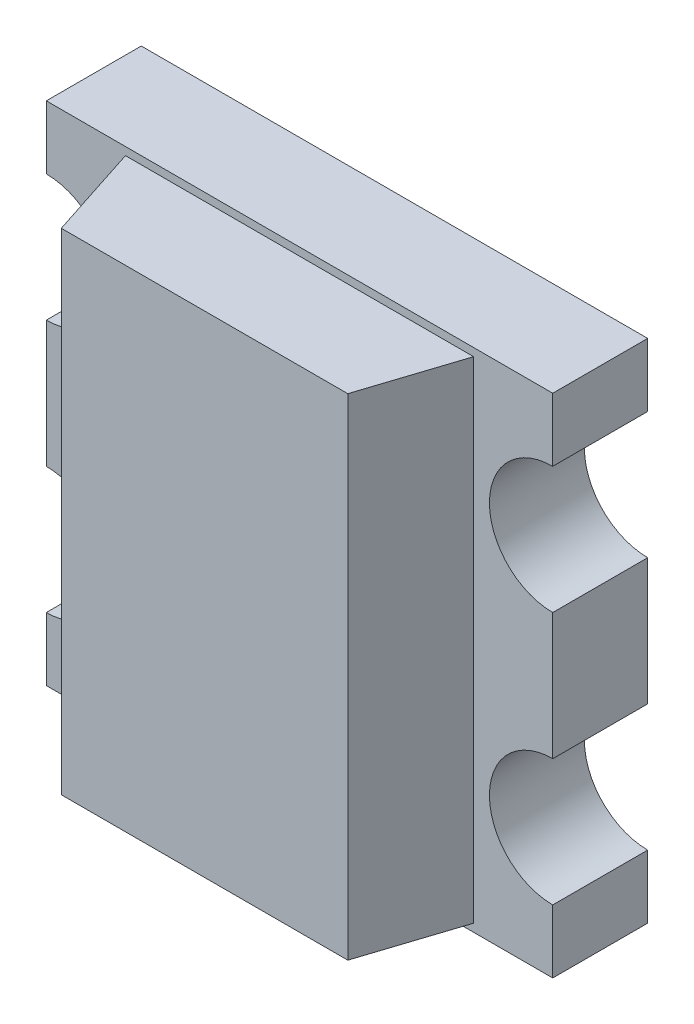
ISO-10303-21;
HEADER;
FILE_DESCRIPTION(('STEP AP214'),'2;1');
FILE_NAME('part.step','',(''),(''),'','','');
FILE_SCHEMA(('AUTOMOTIVE_DESIGN { 1 0 10303 214 1 1 1 1 }'));
ENDSEC;
DATA;
#1=APPLICATION_CONTEXT('core data for automotive mechanical design processes');
#2=APPLICATION_PROTOCOL_DEFINITION('international standard','automotive_design',2000,#1);
#3=PRODUCT_CONTEXT('',#1,'mechanical');
#4=PRODUCT('Part','Part','',(#3));
#5=PRODUCT_RELATED_PRODUCT_CATEGORY('part','',(#4));
#6=PRODUCT_DEFINITION_FORMATION('','',#4);
#7=PRODUCT_DEFINITION_CONTEXT('part definition',#1,'design');
#8=PRODUCT_DEFINITION('design','',#6,#7);
#9=PRODUCT_DEFINITION_SHAPE('','',#8);
#10=(LENGTH_UNIT() NAMED_UNIT(*) SI_UNIT(.MILLI.,.METRE.));
#11=(NAMED_UNIT(*) PLANE_ANGLE_UNIT() SI_UNIT($,.RADIAN.));
#12=(NAMED_UNIT(*) SI_UNIT($,.STERADIAN.) SOLID_ANGLE_UNIT());
#13=UNCERTAINTY_MEASURE_WITH_UNIT(LENGTH_MEASURE(1.E-05),#10,'distance_accuracy_value','');
#14=(GEOMETRIC_REPRESENTATION_CONTEXT(3) GLOBAL_UNCERTAINTY_ASSIGNED_CONTEXT((#13)) GLOBAL_UNIT_ASSIGNED_CONTEXT((#10,
#11,#12)) REPRESENTATION_CONTEXT('',''));
#15=CARTESIAN_POINT('',(0.,0.,0.));
#16=DIRECTION('',(0.,0.,1.));
#17=DIRECTION('',(1.,0.,0.));
#18=AXIS2_PLACEMENT_3D('',#15,#16,#17);
#19=CARTESIAN_POINT('',(0.8,0.4,0.3));
#20=DIRECTION('',(0.,0.,1.));
#21=DIRECTION('',(1.,0.,0.));
#22=AXIS2_PLACEMENT_3D('',#19,#20,#21);
#23=PLANE('',#22);
#24=DIRECTION('',(0.,1.,0.));
#25=VECTOR('',#24,1.);
#26=CARTESIAN_POINT('',(0.8,0.8,0.3));
#27=LINE('',#26,#25);
#28=CARTESIAN_POINT('',(0.8,0.6,0.3));
#29=VERTEX_POINT('',#28);
#30=CARTESIAN_POINT('',(0.8,0.8,0.3));
#31=VERTEX_POINT('',#30);
#32=EDGE_CURVE('E192',#29,#31,#27,.T.);
#33=ORIENTED_EDGE('',*,*,#32,.T.);
#34=DIRECTION('',(-1.,0.,0.));
#35=VECTOR('',#34,1.);
#36=CARTESIAN_POINT('',(-0.8,0.8,0.3));
#37=LINE('',#36,#35);
#38=CARTESIAN_POINT('',(-0.8,0.8,0.3));
#39=VERTEX_POINT('',#38);
#40=EDGE_CURVE('E112',#31,#39,#37,.T.);
#41=ORIENTED_EDGE('',*,*,#40,.T.);
#42=DIRECTION('',(0.,-1.,0.));
#43=VECTOR('',#42,1.);
#44=CARTESIAN_POINT('',(-0.8,0.8,0.3));
#45=LINE('',#44,#43);
#46=CARTESIAN_POINT('',(-0.799999999999999,0.6,0.3));
#47=VERTEX_POINT('',#46);
#48=EDGE_CURVE('E219',#39,#47,#45,.T.);
#49=ORIENTED_EDGE('',*,*,#48,.T.);
#50=CARTESIAN_POINT('',(-0.8,0.4,0.3));
#51=DIRECTION('',(0.,0.,-1.));
#52=DIRECTION('',(-1.,0.,0.));
#53=AXIS2_PLACEMENT_3D('',#50,#51,#52);
#54=CIRCLE('',#53,0.2);
#55=CARTESIAN_POINT('',(-0.799999999999999,0.2,0.3));
#56=VERTEX_POINT('',#55);
#57=EDGE_CURVE('E237',#47,#56,#54,.T.);
#58=ORIENTED_EDGE('',*,*,#57,.T.);
#59=DIRECTION('',(0.,-1.,0.));
#60=VECTOR('',#59,1.);
#61=CARTESIAN_POINT('',(-0.799999999999999,-0.2,0.3));
#62=LINE('',#61,#60);
#63=CARTESIAN_POINT('',(-0.799999999999999,-0.2,0.3));
#64=VERTEX_POINT('',#63);
#65=EDGE_CURVE('E234',#56,#64,#62,.T.);
#66=ORIENTED_EDGE('',*,*,#65,.T.);
#67=CARTESIAN_POINT('',(-0.8,-0.4,0.3));
#68=DIRECTION('',(0.,0.,-1.));
#69=DIRECTION('',(1.,0.,0.));
#70=AXIS2_PLACEMENT_3D('',#67,#68,#69);
#71=CIRCLE('',#70,0.2);
#72=CARTESIAN_POINT('',(-0.799999999999999,-0.600000000000001,0.3));
#73=VERTEX_POINT('',#72);
#74=EDGE_CURVE('E236',#64,#73,#71,.T.);
#75=ORIENTED_EDGE('',*,*,#74,.T.);
#76=DIRECTION('',(0.,-1.,0.));
#77=VECTOR('',#76,1.);
#78=CARTESIAN_POINT('',(-0.8,-0.8,0.3));
#79=LINE('',#78,#77);
#80=CARTESIAN_POINT('',(-0.8,-0.8,0.3));
#81=VERTEX_POINT('',#80);
#82=EDGE_CURVE('E239',#73,#81,#79,.T.);
#83=ORIENTED_EDGE('',*,*,#82,.T.);
#84=DIRECTION('',(1.,0.,0.));
#85=VECTOR('',#84,1.);
#86=CARTESIAN_POINT('',(-0.8,-0.8,0.3));
#87=LINE('',#86,#85);
#88=CARTESIAN_POINT('',(0.8,-0.8,0.3));
#89=VERTEX_POINT('',#88);
#90=EDGE_CURVE('E245',#81,#89,#87,.T.);
#91=ORIENTED_EDGE('',*,*,#90,.T.);
#92=DIRECTION('',(0.,1.,0.));
#93=VECTOR('',#92,1.);
#94=CARTESIAN_POINT('',(0.8,-0.8,0.3));
#95=LINE('',#94,#93);
#96=CARTESIAN_POINT('',(0.8,-0.6,0.3));
#97=VERTEX_POINT('',#96);
#98=EDGE_CURVE('E147',#89,#97,#95,.T.);
#99=ORIENTED_EDGE('',*,*,#98,.T.);
#100=CARTESIAN_POINT('',(0.8,-0.4,0.3));
#101=DIRECTION('',(0.,0.,-1.));
#102=DIRECTION('',(-1.,0.,0.));
#103=AXIS2_PLACEMENT_3D('',#100,#101,#102);
#104=CIRCLE('',#103,0.2);
#105=CARTESIAN_POINT('',(0.8,-0.2,0.3));
#106=VERTEX_POINT('',#105);
#107=EDGE_CURVE('E140',#97,#106,#104,.T.);
#108=ORIENTED_EDGE('',*,*,#107,.T.);
#109=DIRECTION('',(0.,1.,0.));
#110=VECTOR('',#109,1.);
#111=CARTESIAN_POINT('',(0.8,-0.2,0.3));
#112=LINE('',#111,#110);
#113=CARTESIAN_POINT('',(0.8,0.2,0.3));
#114=VERTEX_POINT('',#113);
#115=EDGE_CURVE('E144',#106,#114,#112,.T.);
#116=ORIENTED_EDGE('',*,*,#115,.T.);
#117=CARTESIAN_POINT('',(0.8,0.4,0.3));
#118=DIRECTION('',(0.,0.,-1.));
#119=DIRECTION('',(1.,0.,0.));
#120=AXIS2_PLACEMENT_3D('',#117,#118,#119);
#121=CIRCLE('',#120,0.2);
#122=EDGE_CURVE('E59',#114,#29,#121,.T.);
#123=ORIENTED_EDGE('',*,*,#122,.T.);
#124=EDGE_LOOP('',(#33,#41,#49,#58,#66,#75,#83,#91,#99,#108,#116,#123));
#125=FACE_BOUND('',#124,.T.);
#126=DIRECTION('',(0.,-1.,0.));
#127=VECTOR('',#126,1.);
#128=CARTESIAN_POINT('',(0.55,0.775,0.3));
#129=LINE('',#128,#127);
#130=CARTESIAN_POINT('',(0.55,0.775,0.3));
#131=VERTEX_POINT('',#130);
#132=CARTESIAN_POINT('',(0.55,-0.775,0.3));
#133=VERTEX_POINT('',#132);
#134=EDGE_CURVE('E271',#131,#133,#129,.T.);
#135=ORIENTED_EDGE('',*,*,#134,.T.);
#136=DIRECTION('',(-1.,0.,0.));
#137=VECTOR('',#136,1.);
#138=CARTESIAN_POINT('',(-0.55,-0.775,0.3));
#139=LINE('',#138,#137);
#140=CARTESIAN_POINT('',(-0.55,-0.775,0.3));
#141=VERTEX_POINT('',#140);
#142=EDGE_CURVE('E50',#133,#141,#139,.T.);
#143=ORIENTED_EDGE('',*,*,#142,.T.);
#144=DIRECTION('',(0.,-1.,0.));
#145=VECTOR('',#144,1.);
#146=CARTESIAN_POINT('',(-0.55,0.775,0.3));
#147=LINE('',#146,#145);
#148=CARTESIAN_POINT('',(-0.55,0.775,0.3));
#149=VERTEX_POINT('',#148);
#150=EDGE_CURVE('E172',#149,#141,#147,.T.);
#151=ORIENTED_EDGE('',*,*,#150,.F.);
#152=DIRECTION('',(-1.,0.,0.));
#153=VECTOR('',#152,1.);
#154=CARTESIAN_POINT('',(-0.55,0.775,0.3));
#155=LINE('',#154,#153);
#156=EDGE_CURVE('E277',#131,#149,#155,.T.);
#157=ORIENTED_EDGE('',*,*,#156,.F.);
#158=EDGE_LOOP('',(#135,#143,#151,#157));
#159=FACE_BOUND('',#158,.T.);
#160=ADVANCED_FACE('F35',(#125,#159),#23,.T.);
#161=CARTESIAN_POINT('',(0.8,0.8,0.3));
#162=DIRECTION('',(-1.,0.,0.));
#163=DIRECTION('',(0.,-1.,0.));
#164=AXIS2_PLACEMENT_3D('',#161,#162,#163);
#165=PLANE('',#164);
#166=DIRECTION('',(0.,1.,0.));
#167=VECTOR('',#166,1.);
#168=CARTESIAN_POINT('',(0.8,0.8,0.));
#169=LINE('',#168,#167);
#170=CARTESIAN_POINT('',(0.8,0.6,0.));
#171=VERTEX_POINT('',#170);
#172=CARTESIAN_POINT('',(0.8,0.8,0.));
#173=VERTEX_POINT('',#172);
#174=EDGE_CURVE('E168',#171,#173,#169,.T.);
#175=ORIENTED_EDGE('',*,*,#174,.T.);
#176=DIRECTION('',(0.,0.,-1.));
#177=VECTOR('',#176,1.);
#178=CARTESIAN_POINT('',(0.8,0.8,0.3));
#179=LINE('',#178,#177);
#180=EDGE_CURVE('E11',#31,#173,#179,.T.);
#181=ORIENTED_EDGE('',*,*,#180,.F.);
#182=ORIENTED_EDGE('',*,*,#32,.F.);
#183=DIRECTION('',(0.,0.,-1.));
#184=VECTOR('',#183,1.);
#185=CARTESIAN_POINT('',(0.8,0.6,0.3));
#186=LINE('',#185,#184);
#187=EDGE_CURVE('E164',#29,#171,#186,.T.);
#188=ORIENTED_EDGE('',*,*,#187,.T.);
#189=EDGE_LOOP('',(#175,#181,#182,#188));
#190=FACE_BOUND('',#189,.T.);
#191=ADVANCED_FACE('F37',(#190),#165,.F.);
#192=CARTESIAN_POINT('',(-0.8,0.8,0.3));
#193=DIRECTION('',(0.,-1.,0.));
#194=DIRECTION('',(0.,0.,-1.));
#195=AXIS2_PLACEMENT_3D('',#192,#193,#194);
#196=PLANE('',#195);
#197=DIRECTION('',(-1.,0.,0.));
#198=VECTOR('',#197,1.);
#199=CARTESIAN_POINT('',(-0.8,0.8,0.));
#200=LINE('',#199,#198);
#201=CARTESIAN_POINT('',(-0.8,0.8,0.));
#202=VERTEX_POINT('',#201);
#203=EDGE_CURVE('E171',#173,#202,#200,.T.);
#204=ORIENTED_EDGE('',*,*,#203,.T.);
#205=DIRECTION('',(0.,0.,-1.));
#206=VECTOR('',#205,1.);
#207=CARTESIAN_POINT('',(-0.8,0.8,0.3));
#208=LINE('',#207,#206);
#209=EDGE_CURVE('E43',#39,#202,#208,.T.);
#210=ORIENTED_EDGE('',*,*,#209,.F.);
#211=ORIENTED_EDGE('',*,*,#40,.F.);
#212=ORIENTED_EDGE('',*,*,#180,.T.);
#213=EDGE_LOOP('',(#204,#210,#211,#212));
#214=FACE_BOUND('',#213,.T.);
#215=ADVANCED_FACE('F334',(#214),#196,.F.);
#216=CARTESIAN_POINT('',(-0.8,0.8,0.3));
#217=DIRECTION('',(1.,0.,0.));
#218=DIRECTION('',(0.,1.,0.));
#219=AXIS2_PLACEMENT_3D('',#216,#217,#218);
#220=PLANE('',#219);
#221=DIRECTION('',(0.,-1.,0.));
#222=VECTOR('',#221,1.);
#223=CARTESIAN_POINT('',(-0.8,0.8,0.));
#224=LINE('',#223,#222);
#225=CARTESIAN_POINT('',(-0.799999999999999,0.6,0.));
#226=VERTEX_POINT('',#225);
#227=EDGE_CURVE('E174',#202,#226,#224,.T.);
#228=ORIENTED_EDGE('',*,*,#227,.T.);
#229=DIRECTION('',(0.,0.,-1.));
#230=VECTOR('',#229,1.);
#231=CARTESIAN_POINT('',(-0.799999999999999,0.6,0.3));
#232=LINE('',#231,#230);
#233=EDGE_CURVE('E211',#47,#226,#232,.T.);
#234=ORIENTED_EDGE('',*,*,#233,.F.);
#235=ORIENTED_EDGE('',*,*,#48,.F.);
#236=ORIENTED_EDGE('',*,*,#209,.T.);
#237=EDGE_LOOP('',(#228,#234,#235,#236));
#238=FACE_BOUND('',#237,.T.);
#239=ADVANCED_FACE('F217',(#238),#220,.F.);
#240=CARTESIAN_POINT('',(-0.8,0.4,0.3));
#241=DIRECTION('',(0.,0.,-1.));
#242=DIRECTION('',(-1.,0.,0.));
#243=AXIS2_PLACEMENT_3D('',#240,#241,#242);
#244=CYLINDRICAL_SURFACE('',#243,0.2);
#245=CARTESIAN_POINT('',(-0.8,0.4,0.));
#246=DIRECTION('',(0.,0.,-1.));
#247=DIRECTION('',(-1.,0.,0.));
#248=AXIS2_PLACEMENT_3D('',#245,#246,#247);
#249=CIRCLE('',#248,0.2);
#250=CARTESIAN_POINT('',(-0.799999999999999,0.2,0.));
#251=VERTEX_POINT('',#250);
#252=EDGE_CURVE('E176',#226,#251,#249,.T.);
#253=ORIENTED_EDGE('',*,*,#252,.T.);
#254=DIRECTION('',(0.,0.,-1.));
#255=VECTOR('',#254,1.);
#256=CARTESIAN_POINT('',(-0.799999999999999,0.2,0.3));
#257=LINE('',#256,#255);
#258=EDGE_CURVE('E208',#56,#251,#257,.T.);
#259=ORIENTED_EDGE('',*,*,#258,.F.);
#260=ORIENTED_EDGE('',*,*,#57,.F.);
#261=ORIENTED_EDGE('',*,*,#233,.T.);
#262=EDGE_LOOP('',(#253,#259,#260,#261));
#263=FACE_BOUND('',#262,.T.);
#264=ADVANCED_FACE('F228',(#263),#244,.F.);
#265=CARTESIAN_POINT('',(-0.799999999999999,-0.2,0.3));
#266=DIRECTION('',(1.,0.,0.));
#267=DIRECTION('',(0.,0.,-1.));
#268=AXIS2_PLACEMENT_3D('',#265,#266,#267);
#269=PLANE('',#268);
#270=DIRECTION('',(0.,-1.,0.));
#271=VECTOR('',#270,1.);
#272=CARTESIAN_POINT('',(-0.799999999999999,-0.2,0.));
#273=LINE('',#272,#271);
#274=CARTESIAN_POINT('',(-0.799999999999999,-0.2,0.));
#275=VERTEX_POINT('',#274);
#276=EDGE_CURVE('E178',#251,#275,#273,.T.);
#277=ORIENTED_EDGE('',*,*,#276,.T.);
#278=DIRECTION('',(0.,0.,-1.));
#279=VECTOR('',#278,1.);
#280=CARTESIAN_POINT('',(-0.799999999999999,-0.2,0.3));
#281=LINE('',#280,#279);
#282=EDGE_CURVE('E205',#64,#275,#281,.T.);
#283=ORIENTED_EDGE('',*,*,#282,.F.);
#284=ORIENTED_EDGE('',*,*,#65,.F.);
#285=ORIENTED_EDGE('',*,*,#258,.T.);
#286=EDGE_LOOP('',(#277,#283,#284,#285));
#287=FACE_BOUND('',#286,.T.);
#288=ADVANCED_FACE('F232',(#287),#269,.F.);
#289=CARTESIAN_POINT('',(-0.8,-0.4,0.3));
#290=DIRECTION('',(0.,0.,-1.));
#291=DIRECTION('',(-1.,0.,0.));
#292=AXIS2_PLACEMENT_3D('',#289,#290,#291);
#293=CYLINDRICAL_SURFACE('',#292,0.2);
#294=CARTESIAN_POINT('',(-0.8,-0.4,0.));
#295=DIRECTION('',(0.,0.,-1.));
#296=DIRECTION('',(1.,0.,0.));
#297=AXIS2_PLACEMENT_3D('',#294,#295,#296);
#298=CIRCLE('',#297,0.2);
#299=CARTESIAN_POINT('',(-0.799999999999999,-0.600000000000001,0.));
#300=VERTEX_POINT('',#299);
#301=EDGE_CURVE('E180',#275,#300,#298,.T.);
#302=ORIENTED_EDGE('',*,*,#301,.T.);
#303=DIRECTION('',(0.,0.,-1.));
#304=VECTOR('',#303,1.);
#305=CARTESIAN_POINT('',(-0.799999999999999,-0.600000000000001,0.3));
#306=LINE('',#305,#304);
#307=EDGE_CURVE('E202',#73,#300,#306,.T.);
#308=ORIENTED_EDGE('',*,*,#307,.F.);
#309=ORIENTED_EDGE('',*,*,#74,.F.);
#310=ORIENTED_EDGE('',*,*,#282,.T.);
#311=EDGE_LOOP('',(#302,#308,#309,#310));
#312=FACE_BOUND('',#311,.T.);
#313=ADVANCED_FACE('F353',(#312),#293,.F.);
#314=CARTESIAN_POINT('',(-0.8,-0.8,0.3));
#315=DIRECTION('',(1.,0.,0.));
#316=DIRECTION('',(0.,1.,0.));
#317=AXIS2_PLACEMENT_3D('',#314,#315,#316);
#318=PLANE('',#317);
#319=DIRECTION('',(0.,-1.,0.));
#320=VECTOR('',#319,1.);
#321=CARTESIAN_POINT('',(-0.8,-0.8,0.));
#322=LINE('',#321,#320);
#323=CARTESIAN_POINT('',(-0.8,-0.8,0.));
#324=VERTEX_POINT('',#323);
#325=EDGE_CURVE('E182',#300,#324,#322,.T.);
#326=ORIENTED_EDGE('',*,*,#325,.T.);
#327=DIRECTION('',(0.,0.,-1.));
#328=VECTOR('',#327,1.);
#329=CARTESIAN_POINT('',(-0.8,-0.8,0.3));
#330=LINE('',#329,#328);
#331=EDGE_CURVE('E199',#81,#324,#330,.T.);
#332=ORIENTED_EDGE('',*,*,#331,.F.);
#333=ORIENTED_EDGE('',*,*,#82,.F.);
#334=ORIENTED_EDGE('',*,*,#307,.T.);
#335=EDGE_LOOP('',(#326,#332,#333,#334));
#336=FACE_BOUND('',#335,.T.);
#337=ADVANCED_FACE('F350',(#336),#318,.F.);
#338=CARTESIAN_POINT('',(-0.8,-0.8,0.3));
#339=DIRECTION('',(0.,1.,0.));
#340=DIRECTION('',(0.,0.,1.));
#341=AXIS2_PLACEMENT_3D('',#338,#339,#340);
#342=PLANE('',#341);
#343=DIRECTION('',(1.,0.,0.));
#344=VECTOR('',#343,1.);
#345=CARTESIAN_POINT('',(-0.8,-0.8,0.));
#346=LINE('',#345,#344);
#347=CARTESIAN_POINT('',(0.8,-0.8,0.));
#348=VERTEX_POINT('',#347);
#349=EDGE_CURVE('E184',#324,#348,#346,.T.);
#350=ORIENTED_EDGE('',*,*,#349,.T.);
#351=DIRECTION('',(0.,0.,-1.));
#352=VECTOR('',#351,1.);
#353=CARTESIAN_POINT('',(0.8,-0.8,0.3));
#354=LINE('',#353,#352);
#355=EDGE_CURVE('E196',#89,#348,#354,.T.);
#356=ORIENTED_EDGE('',*,*,#355,.F.);
#357=ORIENTED_EDGE('',*,*,#90,.F.);
#358=ORIENTED_EDGE('',*,*,#331,.T.);
#359=EDGE_LOOP('',(#350,#356,#357,#358));
#360=FACE_BOUND('',#359,.T.);
#361=ADVANCED_FACE('F251',(#360),#342,.F.);
#362=CARTESIAN_POINT('',(0.8,-0.8,0.3));
#363=DIRECTION('',(-1.,0.,0.));
#364=DIRECTION('',(0.,-1.,0.));
#365=AXIS2_PLACEMENT_3D('',#362,#363,#364);
#366=PLANE('',#365);
#367=DIRECTION('',(0.,1.,0.));
#368=VECTOR('',#367,1.);
#369=CARTESIAN_POINT('',(0.8,-0.8,0.));
#370=LINE('',#369,#368);
#371=CARTESIAN_POINT('',(0.8,-0.6,0.));
#372=VERTEX_POINT('',#371);
#373=EDGE_CURVE('E186',#348,#372,#370,.T.);
#374=ORIENTED_EDGE('',*,*,#373,.T.);
#375=DIRECTION('',(0.,0.,-1.));
#376=VECTOR('',#375,1.);
#377=CARTESIAN_POINT('',(0.8,-0.6,0.3));
#378=LINE('',#377,#376);
#379=EDGE_CURVE('E159',#97,#372,#378,.T.);
#380=ORIENTED_EDGE('',*,*,#379,.F.);
#381=ORIENTED_EDGE('',*,*,#98,.F.);
#382=ORIENTED_EDGE('',*,*,#355,.T.);
#383=EDGE_LOOP('',(#374,#380,#381,#382));
#384=FACE_BOUND('',#383,.T.);
#385=ADVANCED_FACE('F255',(#384),#366,.F.);
#386=CARTESIAN_POINT('',(0.8,-0.4,0.3));
#387=DIRECTION('',(0.,0.,-1.));
#388=DIRECTION('',(-1.,0.,0.));
#389=AXIS2_PLACEMENT_3D('',#386,#387,#388);
#390=CYLINDRICAL_SURFACE('',#389,0.2);
#391=CARTESIAN_POINT('',(0.8,-0.4,0.));
#392=DIRECTION('',(0.,0.,-1.));
#393=DIRECTION('',(-1.,0.,0.));
#394=AXIS2_PLACEMENT_3D('',#391,#392,#393);
#395=CIRCLE('',#394,0.2);
#396=CARTESIAN_POINT('',(0.8,-0.2,0.));
#397=VERTEX_POINT('',#396);
#398=EDGE_CURVE('E156',#372,#397,#395,.T.);
#399=ORIENTED_EDGE('',*,*,#398,.T.);
#400=DIRECTION('',(0.,0.,-1.));
#401=VECTOR('',#400,1.);
#402=CARTESIAN_POINT('',(0.8,-0.2,0.3));
#403=LINE('',#402,#401);
#404=EDGE_CURVE('E153',#106,#397,#403,.T.);
#405=ORIENTED_EDGE('',*,*,#404,.F.);
#406=ORIENTED_EDGE('',*,*,#107,.F.);
#407=ORIENTED_EDGE('',*,*,#379,.T.);
#408=EDGE_LOOP('',(#399,#405,#406,#407));
#409=FACE_BOUND('',#408,.T.);
#410=ADVANCED_FACE('F154',(#409),#390,.F.);
#411=CARTESIAN_POINT('',(0.8,-0.2,0.3));
#412=DIRECTION('',(-1.,0.,0.));
#413=DIRECTION('',(0.,0.,1.));
#414=AXIS2_PLACEMENT_3D('',#411,#412,#413);
#415=PLANE('',#414);
#416=DIRECTION('',(0.,1.,0.));
#417=VECTOR('',#416,1.);
#418=CARTESIAN_POINT('',(0.8,-0.2,0.));
#419=LINE('',#418,#417);
#420=CARTESIAN_POINT('',(0.8,0.2,0.));
#421=VERTEX_POINT('',#420);
#422=EDGE_CURVE('E189',#397,#421,#419,.T.);
#423=ORIENTED_EDGE('',*,*,#422,.T.);
#424=DIRECTION('',(0.,0.,-1.));
#425=VECTOR('',#424,1.);
#426=CARTESIAN_POINT('',(0.8,0.2,0.3));
#427=LINE('',#426,#425);
#428=EDGE_CURVE('E160',#114,#421,#427,.T.);
#429=ORIENTED_EDGE('',*,*,#428,.F.);
#430=ORIENTED_EDGE('',*,*,#115,.F.);
#431=ORIENTED_EDGE('',*,*,#404,.T.);
#432=EDGE_LOOP('',(#423,#429,#430,#431));
#433=FACE_BOUND('',#432,.T.);
#434=ADVANCED_FACE('F162',(#433),#415,.F.);
#435=CARTESIAN_POINT('',(0.8,0.4,0.3));
#436=DIRECTION('',(0.,0.,-1.));
#437=DIRECTION('',(-1.,0.,0.));
#438=AXIS2_PLACEMENT_3D('',#435,#436,#437);
#439=CYLINDRICAL_SURFACE('',#438,0.2);
#440=CARTESIAN_POINT('',(0.8,0.4,0.));
#441=DIRECTION('',(0.,0.,-1.));
#442=DIRECTION('',(1.,0.,0.));
#443=AXIS2_PLACEMENT_3D('',#440,#441,#442);
#444=CIRCLE('',#443,0.2);
#445=EDGE_CURVE('E104',#421,#171,#444,.T.);
#446=ORIENTED_EDGE('',*,*,#445,.T.);
#447=ORIENTED_EDGE('',*,*,#187,.F.);
#448=ORIENTED_EDGE('',*,*,#122,.F.);
#449=ORIENTED_EDGE('',*,*,#428,.T.);
#450=EDGE_LOOP('',(#446,#447,#448,#449));
#451=FACE_BOUND('',#450,.T.);
#452=ADVANCED_FACE('F256',(#451),#439,.F.);
#453=CARTESIAN_POINT('',(0.8,0.4,0.));
#454=DIRECTION('',(0.,0.,1.));
#455=DIRECTION('',(1.,0.,0.));
#456=AXIS2_PLACEMENT_3D('',#453,#454,#455);
#457=PLANE('',#456);
#458=ORIENTED_EDGE('',*,*,#174,.F.);
#459=ORIENTED_EDGE('',*,*,#445,.F.);
#460=ORIENTED_EDGE('',*,*,#422,.F.);
#461=ORIENTED_EDGE('',*,*,#398,.F.);
#462=ORIENTED_EDGE('',*,*,#373,.F.);
#463=ORIENTED_EDGE('',*,*,#349,.F.);
#464=ORIENTED_EDGE('',*,*,#325,.F.);
#465=ORIENTED_EDGE('',*,*,#301,.F.);
#466=ORIENTED_EDGE('',*,*,#276,.F.);
#467=ORIENTED_EDGE('',*,*,#252,.F.);
#468=ORIENTED_EDGE('',*,*,#227,.F.);
#469=ORIENTED_EDGE('',*,*,#203,.F.);
#470=EDGE_LOOP('',(#458,#459,#460,#461,#462,#463,#464,#465,#466,#467,#468,#469));
#471=FACE_BOUND('',#470,.T.);
#472=ADVANCED_FACE('F223',(#471),#457,.F.);
#473=CARTESIAN_POINT('',(-0.55,0.775,0.3));
#474=DIRECTION('',(0.951056516295154,0.,-0.309016994374945));
#475=DIRECTION('',(-0.309016994374945,0.,-0.951056516295155));
#476=AXIS2_PLACEMENT_3D('',#473,#474,#475);
#477=PLANE('',#476);
#478=DIRECTION('',(0.309016994374945,0.,0.951056516295155));
#479=VECTOR('',#478,1.);
#480=CARTESIAN_POINT('',(-0.55,-0.775,0.3));
#481=LINE('',#480,#479);
#482=CARTESIAN_POINT('',(-0.452524091130129,-0.775,0.6));
#483=VERTEX_POINT('',#482);
#484=EDGE_CURVE('E281',#141,#483,#481,.T.);
#485=ORIENTED_EDGE('',*,*,#484,.T.);
#486=DIRECTION('',(0.,-1.,0.));
#487=VECTOR('',#486,1.);
#488=CARTESIAN_POINT('',(-0.452524091130129,0.775,0.6));
#489=LINE('',#488,#487);
#490=CARTESIAN_POINT('',(-0.452524091130129,0.775,0.6));
#491=VERTEX_POINT('',#490);
#492=EDGE_CURVE('E265',#491,#483,#489,.T.);
#493=ORIENTED_EDGE('',*,*,#492,.F.);
#494=DIRECTION('',(0.309016994374945,0.,0.951056516295155));
#495=VECTOR('',#494,1.);
#496=CARTESIAN_POINT('',(-0.55,0.775,0.3));
#497=LINE('',#496,#495);
#498=EDGE_CURVE('E290',#149,#491,#497,.T.);
#499=ORIENTED_EDGE('',*,*,#498,.F.);
#500=ORIENTED_EDGE('',*,*,#150,.T.);
#501=EDGE_LOOP('',(#485,#493,#499,#500));
#502=FACE_BOUND('',#501,.T.);
#503=ADVANCED_FACE('F307',(#502),#477,.F.);
#504=CARTESIAN_POINT('',(0.452524091130129,0.775,0.6));
#505=DIRECTION('',(0.,0.,-1.));
#506=DIRECTION('',(-1.,0.,0.));
#507=AXIS2_PLACEMENT_3D('',#504,#505,#506);
#508=PLANE('',#507);
#509=DIRECTION('',(1.,0.,0.));
#510=VECTOR('',#509,1.);
#511=CARTESIAN_POINT('',(0.452524091130129,-0.775,0.6));
#512=LINE('',#511,#510);
#513=CARTESIAN_POINT('',(0.452524091130129,-0.775,0.6));
#514=VERTEX_POINT('',#513);
#515=EDGE_CURVE('E278',#483,#514,#512,.T.);
#516=ORIENTED_EDGE('',*,*,#515,.T.);
#517=DIRECTION('',(0.,-1.,0.));
#518=VECTOR('',#517,1.);
#519=CARTESIAN_POINT('',(0.452524091130129,0.775,0.6));
#520=LINE('',#519,#518);
#521=CARTESIAN_POINT('',(0.452524091130129,0.775,0.6));
#522=VERTEX_POINT('',#521);
#523=EDGE_CURVE('E268',#522,#514,#520,.T.);
#524=ORIENTED_EDGE('',*,*,#523,.F.);
#525=DIRECTION('',(1.,0.,0.));
#526=VECTOR('',#525,1.);
#527=CARTESIAN_POINT('',(0.452524091130129,0.775,0.6));
#528=LINE('',#527,#526);
#529=EDGE_CURVE('E287',#491,#522,#528,.T.);
#530=ORIENTED_EDGE('',*,*,#529,.F.);
#531=ORIENTED_EDGE('',*,*,#492,.T.);
#532=EDGE_LOOP('',(#516,#524,#530,#531));
#533=FACE_BOUND('',#532,.T.);
#534=ADVANCED_FACE('F318',(#533),#508,.F.);
#535=CARTESIAN_POINT('',(0.55,0.775,0.3));
#536=DIRECTION('',(-0.951056516295154,0.,-0.309016994374945));
#537=DIRECTION('',(-0.309016994374945,0.,0.951056516295155));
#538=AXIS2_PLACEMENT_3D('',#535,#536,#537);
#539=PLANE('',#538);
#540=DIRECTION('',(0.309016994374945,0.,-0.951056516295155));
#541=VECTOR('',#540,1.);
#542=CARTESIAN_POINT('',(0.55,-0.775,0.3));
#543=LINE('',#542,#541);
#544=EDGE_CURVE('E275',#514,#133,#543,.T.);
#545=ORIENTED_EDGE('',*,*,#544,.T.);
#546=ORIENTED_EDGE('',*,*,#134,.F.);
#547=DIRECTION('',(0.309016994374945,0.,-0.951056516295155));
#548=VECTOR('',#547,1.);
#549=CARTESIAN_POINT('',(0.55,0.775,0.3));
#550=LINE('',#549,#548);
#551=EDGE_CURVE('E274',#522,#131,#550,.T.);
#552=ORIENTED_EDGE('',*,*,#551,.F.);
#553=ORIENTED_EDGE('',*,*,#523,.T.);
#554=EDGE_LOOP('',(#545,#546,#552,#553));
#555=FACE_BOUND('',#554,.T.);
#556=ADVANCED_FACE('F320',(#555),#539,.F.);
#557=CARTESIAN_POINT('',(0.,0.775,0.));
#558=DIRECTION('',(0.,-1.,0.));
#559=DIRECTION('',(0.,0.,-1.));
#560=AXIS2_PLACEMENT_3D('',#557,#558,#559);
#561=PLANE('',#560);
#562=ORIENTED_EDGE('',*,*,#156,.T.);
#563=ORIENTED_EDGE('',*,*,#498,.T.);
#564=ORIENTED_EDGE('',*,*,#529,.T.);
#565=ORIENTED_EDGE('',*,*,#551,.T.);
#566=EDGE_LOOP('',(#562,#563,#564,#565));
#567=FACE_BOUND('',#566,.T.);
#568=ADVANCED_FACE('F298',(#567),#561,.F.);
#569=CARTESIAN_POINT('',(0.,-0.775,0.));
#570=DIRECTION('',(0.,-1.,0.));
#571=DIRECTION('',(0.,0.,-1.));
#572=AXIS2_PLACEMENT_3D('',#569,#570,#571);
#573=PLANE('',#572);
#574=ORIENTED_EDGE('',*,*,#142,.F.);
#575=ORIENTED_EDGE('',*,*,#544,.F.);
#576=ORIENTED_EDGE('',*,*,#515,.F.);
#577=ORIENTED_EDGE('',*,*,#484,.F.);
#578=EDGE_LOOP('',(#574,#575,#576,#577));
#579=FACE_BOUND('',#578,.T.);
#580=ADVANCED_FACE('F321',(#579),#573,.T.);
#581=CLOSED_SHELL('',(#160,#191,#215,#239,#264,#288,#313,#337,#361,#385,#410,#434,#452,#472,
#503,#534,#556,#568,#580));
#582=MANIFOLD_SOLID_BREP('B2',#581);
#583=ADVANCED_BREP_SHAPE_REPRESENTATION('',(#18,#582),#14);
#584=SHAPE_DEFINITION_REPRESENTATION(#9,#583);
ENDSEC;
END-ISO-10303-21;
